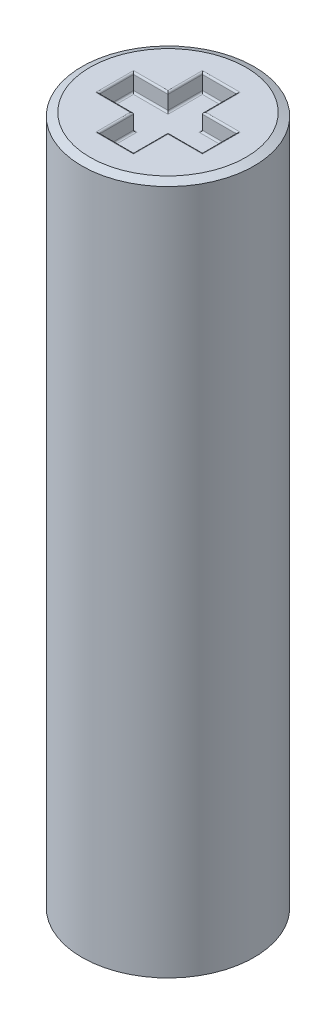
ISO-10303-21;
HEADER;
FILE_DESCRIPTION(('STEP AP214'),'2;1');
FILE_NAME('part.step','',(''),(''),'','','');
FILE_SCHEMA(('AUTOMOTIVE_DESIGN { 1 0 10303 214 1 1 1 1 }'));
ENDSEC;
DATA;
#1=APPLICATION_CONTEXT('core data for automotive mechanical design processes');
#2=APPLICATION_PROTOCOL_DEFINITION('international standard','automotive_design',2000,#1);
#3=PRODUCT_CONTEXT('',#1,'mechanical');
#4=PRODUCT('Part','Part','',(#3));
#5=PRODUCT_RELATED_PRODUCT_CATEGORY('part','',(#4));
#6=PRODUCT_DEFINITION_FORMATION('','',#4);
#7=PRODUCT_DEFINITION_CONTEXT('part definition',#1,'design');
#8=PRODUCT_DEFINITION('design','',#6,#7);
#9=PRODUCT_DEFINITION_SHAPE('','',#8);
#10=(LENGTH_UNIT() NAMED_UNIT(*) SI_UNIT(.MILLI.,.METRE.));
#11=(NAMED_UNIT(*) PLANE_ANGLE_UNIT() SI_UNIT($,.RADIAN.));
#12=(NAMED_UNIT(*) SI_UNIT($,.STERADIAN.) SOLID_ANGLE_UNIT());
#13=UNCERTAINTY_MEASURE_WITH_UNIT(LENGTH_MEASURE(1.E-05),#10,'distance_accuracy_value','');
#14=(GEOMETRIC_REPRESENTATION_CONTEXT(3) GLOBAL_UNCERTAINTY_ASSIGNED_CONTEXT((#13)) GLOBAL_UNIT_ASSIGNED_CONTEXT((#10,
#11,#12)) REPRESENTATION_CONTEXT('',''));
#15=CARTESIAN_POINT('',(0.,0.,0.));
#16=DIRECTION('',(0.,0.,1.));
#17=DIRECTION('',(1.,0.,0.));
#18=AXIS2_PLACEMENT_3D('',#15,#16,#17);
#19=CARTESIAN_POINT('',(0.,20.,0.));
#20=DIRECTION('',(0.,-1.,0.));
#21=DIRECTION('',(0.,0.,-1.));
#22=AXIS2_PLACEMENT_3D('',#19,#20,#21);
#23=CYLINDRICAL_SURFACE('',#22,2.5);
#24=CARTESIAN_POINT('',(0.,19.9,0.));
#25=DIRECTION('',(0.,1.,0.));
#26=DIRECTION('',(0.,0.,1.));
#27=AXIS2_PLACEMENT_3D('',#24,#25,#26);
#28=CIRCLE('',#27,2.5);
#29=CARTESIAN_POINT('',(0.,19.9,2.5));
#30=VERTEX_POINT('',#29);
#31=EDGE_CURVE('E236',#30,#30,#28,.F.);
#32=ORIENTED_EDGE('',*,*,#31,.T.);
#33=EDGE_LOOP('',(#32));
#34=FACE_BOUND('',#33,.T.);
#35=CARTESIAN_POINT('',(0.,0.,0.));
#36=DIRECTION('',(0.,1.,0.));
#37=DIRECTION('',(0.,0.,1.));
#38=AXIS2_PLACEMENT_3D('',#35,#36,#37);
#39=CIRCLE('',#38,2.5);
#40=CARTESIAN_POINT('',(0.,0.,2.5));
#41=VERTEX_POINT('',#40);
#42=EDGE_CURVE('E421',#41,#41,#39,.T.);
#43=ORIENTED_EDGE('',*,*,#42,.T.);
#44=EDGE_LOOP('',(#43));
#45=FACE_BOUND('',#44,.T.);
#46=ADVANCED_FACE('F40',(#34,#45),#23,.T.);
#47=CARTESIAN_POINT('',(0.,20.,0.));
#48=DIRECTION('',(0.,1.,0.));
#49=DIRECTION('',(0.,0.,1.));
#50=AXIS2_PLACEMENT_3D('',#47,#48,#49);
#51=PLANE('',#50);
#52=DIRECTION('',(0.,0.,1.));
#53=VECTOR('',#52,1.);
#54=CARTESIAN_POINT('',(-1.55,20.,-0.499999999999999));
#55=LINE('',#54,#53);
#56=CARTESIAN_POINT('',(-1.55,20.,0.550000000000001));
#57=VERTEX_POINT('',#56);
#58=CARTESIAN_POINT('',(-1.55,20.,-0.549999999999999));
#59=VERTEX_POINT('',#58);
#60=EDGE_CURVE('E266',#57,#59,#55,.F.);
#61=ORIENTED_EDGE('',*,*,#60,.T.);
#62=DIRECTION('',(-1.,0.,0.));
#63=VECTOR('',#62,1.);
#64=CARTESIAN_POINT('',(-0.5,20.,-0.549999999999999));
#65=LINE('',#64,#63);
#66=CARTESIAN_POINT('',(-0.55,20.,-0.549999999999999));
#67=VERTEX_POINT('',#66);
#68=EDGE_CURVE('E209',#59,#67,#65,.F.);
#69=ORIENTED_EDGE('',*,*,#68,.T.);
#70=DIRECTION('',(0.,0.,1.));
#71=VECTOR('',#70,1.);
#72=CARTESIAN_POINT('',(-0.55,20.,-1.5));
#73=LINE('',#72,#71);
#74=CARTESIAN_POINT('',(-0.55,20.,-1.55));
#75=VERTEX_POINT('',#74);
#76=EDGE_CURVE('E238',#67,#75,#73,.F.);
#77=ORIENTED_EDGE('',*,*,#76,.T.);
#78=DIRECTION('',(-1.,0.,0.));
#79=VECTOR('',#78,1.);
#80=CARTESIAN_POINT('',(0.5,20.,-1.55));
#81=LINE('',#80,#79);
#82=CARTESIAN_POINT('',(0.55,20.,-1.55));
#83=VERTEX_POINT('',#82);
#84=EDGE_CURVE('E247',#75,#83,#81,.F.);
#85=ORIENTED_EDGE('',*,*,#84,.T.);
#86=DIRECTION('',(0.,0.,-1.));
#87=VECTOR('',#86,1.);
#88=CARTESIAN_POINT('',(0.55,20.,-0.499999999999999));
#89=LINE('',#88,#87);
#90=CARTESIAN_POINT('',(0.55,20.,-0.549999999999999));
#91=VERTEX_POINT('',#90);
#92=EDGE_CURVE('E246',#83,#91,#89,.F.);
#93=ORIENTED_EDGE('',*,*,#92,.T.);
#94=DIRECTION('',(-1.,0.,0.));
#95=VECTOR('',#94,1.);
#96=CARTESIAN_POINT('',(1.5,20.,-0.549999999999999));
#97=LINE('',#96,#95);
#98=CARTESIAN_POINT('',(1.55,20.,-0.549999999999999));
#99=VERTEX_POINT('',#98);
#100=EDGE_CURVE('E252',#91,#99,#97,.F.);
#101=ORIENTED_EDGE('',*,*,#100,.T.);
#102=DIRECTION('',(0.,0.,-1.));
#103=VECTOR('',#102,1.);
#104=CARTESIAN_POINT('',(1.55,20.,0.500000000000001));
#105=LINE('',#104,#103);
#106=CARTESIAN_POINT('',(1.55,20.,0.550000000000001));
#107=VERTEX_POINT('',#106);
#108=EDGE_CURVE('E255',#99,#107,#105,.F.);
#109=ORIENTED_EDGE('',*,*,#108,.T.);
#110=DIRECTION('',(1.,0.,0.));
#111=VECTOR('',#110,1.);
#112=CARTESIAN_POINT('',(0.5,20.,0.550000000000001));
#113=LINE('',#112,#111);
#114=CARTESIAN_POINT('',(0.55,20.,0.550000000000001));
#115=VERTEX_POINT('',#114);
#116=EDGE_CURVE('E258',#107,#115,#113,.F.);
#117=ORIENTED_EDGE('',*,*,#116,.T.);
#118=DIRECTION('',(0.,0.,-1.));
#119=VECTOR('',#118,1.);
#120=CARTESIAN_POINT('',(0.55,20.,1.5));
#121=LINE('',#120,#119);
#122=CARTESIAN_POINT('',(0.55,20.,1.55));
#123=VERTEX_POINT('',#122);
#124=EDGE_CURVE('E256',#115,#123,#121,.F.);
#125=ORIENTED_EDGE('',*,*,#124,.T.);
#126=DIRECTION('',(1.,0.,0.));
#127=VECTOR('',#126,1.);
#128=CARTESIAN_POINT('',(-0.5,20.,1.55));
#129=LINE('',#128,#127);
#130=CARTESIAN_POINT('',(-0.55,20.,1.55));
#131=VERTEX_POINT('',#130);
#132=EDGE_CURVE('E257',#123,#131,#129,.F.);
#133=ORIENTED_EDGE('',*,*,#132,.T.);
#134=DIRECTION('',(0.,0.,1.));
#135=VECTOR('',#134,1.);
#136=CARTESIAN_POINT('',(-0.55,20.,0.500000000000001));
#137=LINE('',#136,#135);
#138=CARTESIAN_POINT('',(-0.55,20.,0.550000000000001));
#139=VERTEX_POINT('',#138);
#140=EDGE_CURVE('E265',#131,#139,#137,.F.);
#141=ORIENTED_EDGE('',*,*,#140,.T.);
#142=DIRECTION('',(1.,0.,0.));
#143=VECTOR('',#142,1.);
#144=CARTESIAN_POINT('',(-1.5,20.,0.550000000000001));
#145=LINE('',#144,#143);
#146=EDGE_CURVE('E262',#139,#57,#145,.F.);
#147=ORIENTED_EDGE('',*,*,#146,.T.);
#148=EDGE_LOOP('',(#61,#69,#77,#85,#93,#101,#109,#117,#125,#133,#141,#147));
#149=FACE_BOUND('',#148,.T.);
#150=CARTESIAN_POINT('',(0.,20.,0.));
#151=DIRECTION('',(0.,1.,0.));
#152=DIRECTION('',(0.,0.,1.));
#153=AXIS2_PLACEMENT_3D('',#150,#151,#152);
#154=CIRCLE('',#153,2.26441476341762);
#155=CARTESIAN_POINT('',(0.,20.,2.26441476341762));
#156=VERTEX_POINT('',#155);
#157=EDGE_CURVE('E242',#156,#156,#154,.T.);
#158=ORIENTED_EDGE('',*,*,#157,.T.);
#159=EDGE_LOOP('',(#158));
#160=FACE_BOUND('',#159,.T.);
#161=ADVANCED_FACE('F427',(#149,#160),#51,.T.);
#162=CARTESIAN_POINT('',(0.,0.,0.));
#163=DIRECTION('',(0.,1.,0.));
#164=DIRECTION('',(0.,0.,1.));
#165=AXIS2_PLACEMENT_3D('',#162,#163,#164);
#166=PLANE('',#165);
#167=ORIENTED_EDGE('',*,*,#42,.F.);
#168=EDGE_LOOP('',(#167));
#169=FACE_BOUND('',#168,.T.);
#170=ADVANCED_FACE('F432',(#169),#166,.F.);
#171=CARTESIAN_POINT('',(0.,20.,0.));
#172=DIRECTION('',(0.,-1.,0.));
#173=DIRECTION('',(0.,0.,-1.));
#174=AXIS2_PLACEMENT_3D('',#171,#172,#173);
#175=CONICAL_SURFACE('',#174,2.26441476341762,1.16937059883622);
#176=ORIENTED_EDGE('',*,*,#31,.F.);
#177=EDGE_LOOP('',(#176));
#178=FACE_BOUND('',#177,.T.);
#179=ORIENTED_EDGE('',*,*,#157,.F.);
#180=EDGE_LOOP('',(#179));
#181=FACE_BOUND('',#180,.T.);
#182=ADVANCED_FACE('F431',(#178,#181),#175,.T.);
#183=CARTESIAN_POINT('',(-0.5,19.5,-0.499999999999999));
#184=DIRECTION('',(-1.,0.,0.));
#185=DIRECTION('',(0.,0.,1.));
#186=AXIS2_PLACEMENT_3D('',#183,#184,#185);
#187=PLANE('',#186);
#188=DIRECTION('',(0.,1.,0.));
#189=VECTOR('',#188,1.);
#190=CARTESIAN_POINT('',(-0.5,19.5,-1.5));
#191=LINE('',#190,#189);
#192=CARTESIAN_POINT('',(-0.5,19.55,-1.5));
#193=VERTEX_POINT('',#192);
#194=CARTESIAN_POINT('',(-0.5,19.95,-1.5));
#195=VERTEX_POINT('',#194);
#196=EDGE_CURVE('E422',#193,#195,#191,.T.);
#197=ORIENTED_EDGE('',*,*,#196,.T.);
#198=DIRECTION('',(0.,0.,1.));
#199=VECTOR('',#198,1.);
#200=CARTESIAN_POINT('',(-0.5,19.95,-0.499999999999999));
#201=LINE('',#200,#199);
#202=CARTESIAN_POINT('',(-0.5,19.95,-0.499999999999999));
#203=VERTEX_POINT('',#202);
#204=EDGE_CURVE('E309',#195,#203,#201,.T.);
#205=ORIENTED_EDGE('',*,*,#204,.T.);
#206=DIRECTION('',(0.,1.,0.));
#207=VECTOR('',#206,1.);
#208=CARTESIAN_POINT('',(-0.5,19.5,-0.499999999999999));
#209=LINE('',#208,#207);
#210=CARTESIAN_POINT('',(-0.5,19.55,-0.499999999999999));
#211=VERTEX_POINT('',#210);
#212=EDGE_CURVE('E222',#211,#203,#209,.T.);
#213=ORIENTED_EDGE('',*,*,#212,.F.);
#214=DIRECTION('',(0.,0.,1.));
#215=VECTOR('',#214,1.);
#216=CARTESIAN_POINT('',(-0.5,19.55,-0.499999999999999));
#217=LINE('',#216,#215);
#218=EDGE_CURVE('E306',#211,#193,#217,.F.);
#219=ORIENTED_EDGE('',*,*,#218,.T.);
#220=EDGE_LOOP('',(#197,#205,#213,#219));
#221=FACE_BOUND('',#220,.T.);
#222=ADVANCED_FACE('F433',(#221),#187,.F.);
#223=CARTESIAN_POINT('',(0.5,19.5,-1.5));
#224=DIRECTION('',(0.,0.,-1.));
#225=DIRECTION('',(-1.,0.,0.));
#226=AXIS2_PLACEMENT_3D('',#223,#224,#225);
#227=PLANE('',#226);
#228=DIRECTION('',(0.,1.,0.));
#229=VECTOR('',#228,1.);
#230=CARTESIAN_POINT('',(0.5,19.5,-1.5));
#231=LINE('',#230,#229);
#232=CARTESIAN_POINT('',(0.5,19.55,-1.5));
#233=VERTEX_POINT('',#232);
#234=CARTESIAN_POINT('',(0.5,19.95,-1.5));
#235=VERTEX_POINT('',#234);
#236=EDGE_CURVE('E611',#233,#235,#231,.T.);
#237=ORIENTED_EDGE('',*,*,#236,.T.);
#238=DIRECTION('',(-1.,0.,0.));
#239=VECTOR('',#238,1.);
#240=CARTESIAN_POINT('',(-0.5,19.95,-1.5));
#241=LINE('',#240,#239);
#242=EDGE_CURVE('E308',#235,#195,#241,.T.);
#243=ORIENTED_EDGE('',*,*,#242,.T.);
#244=ORIENTED_EDGE('',*,*,#196,.F.);
#245=DIRECTION('',(-1.,0.,0.));
#246=VECTOR('',#245,1.);
#247=CARTESIAN_POINT('',(0.5,19.55,-1.5));
#248=LINE('',#247,#246);
#249=EDGE_CURVE('E302',#193,#233,#248,.F.);
#250=ORIENTED_EDGE('',*,*,#249,.T.);
#251=EDGE_LOOP('',(#237,#243,#244,#250));
#252=FACE_BOUND('',#251,.T.);
#253=ADVANCED_FACE('F445',(#252),#227,.F.);
#254=CARTESIAN_POINT('',(0.5,19.5,-0.499999999999999));
#255=DIRECTION('',(1.,0.,0.));
#256=DIRECTION('',(0.,0.,-1.));
#257=AXIS2_PLACEMENT_3D('',#254,#255,#256);
#258=PLANE('',#257);
#259=DIRECTION('',(0.,1.,0.));
#260=VECTOR('',#259,1.);
#261=CARTESIAN_POINT('',(0.5,19.5,-0.499999999999999));
#262=LINE('',#261,#260);
#263=CARTESIAN_POINT('',(0.5,19.55,-0.499999999999999));
#264=VERTEX_POINT('',#263);
#265=CARTESIAN_POINT('',(0.5,19.95,-0.499999999999999));
#266=VERTEX_POINT('',#265);
#267=EDGE_CURVE('E608',#264,#266,#262,.T.);
#268=ORIENTED_EDGE('',*,*,#267,.T.);
#269=DIRECTION('',(0.,0.,-1.));
#270=VECTOR('',#269,1.);
#271=CARTESIAN_POINT('',(0.5,19.95,-1.5));
#272=LINE('',#271,#270);
#273=EDGE_CURVE('E303',#266,#235,#272,.T.);
#274=ORIENTED_EDGE('',*,*,#273,.T.);
#275=ORIENTED_EDGE('',*,*,#236,.F.);
#276=DIRECTION('',(0.,0.,-1.));
#277=VECTOR('',#276,1.);
#278=CARTESIAN_POINT('',(0.5,19.55,-0.499999999999999));
#279=LINE('',#278,#277);
#280=EDGE_CURVE('E300',#233,#264,#279,.F.);
#281=ORIENTED_EDGE('',*,*,#280,.T.);
#282=EDGE_LOOP('',(#268,#274,#275,#281));
#283=FACE_BOUND('',#282,.T.);
#284=ADVANCED_FACE('F486',(#283),#258,.F.);
#285=CARTESIAN_POINT('',(0.5,19.5,-0.499999999999999));
#286=DIRECTION('',(0.,0.,-1.));
#287=DIRECTION('',(-1.,0.,0.));
#288=AXIS2_PLACEMENT_3D('',#285,#286,#287);
#289=PLANE('',#288);
#290=DIRECTION('',(0.,1.,0.));
#291=VECTOR('',#290,1.);
#292=CARTESIAN_POINT('',(1.5,19.5,-0.499999999999999));
#293=LINE('',#292,#291);
#294=CARTESIAN_POINT('',(1.5,19.55,-0.499999999999999));
#295=VERTEX_POINT('',#294);
#296=CARTESIAN_POINT('',(1.5,19.95,-0.499999999999999));
#297=VERTEX_POINT('',#296);
#298=EDGE_CURVE('E609',#295,#297,#293,.T.);
#299=ORIENTED_EDGE('',*,*,#298,.T.);
#300=DIRECTION('',(-1.,0.,0.));
#301=VECTOR('',#300,1.);
#302=CARTESIAN_POINT('',(0.5,19.95,-0.499999999999999));
#303=LINE('',#302,#301);
#304=EDGE_CURVE('E299',#297,#266,#303,.T.);
#305=ORIENTED_EDGE('',*,*,#304,.T.);
#306=ORIENTED_EDGE('',*,*,#267,.F.);
#307=DIRECTION('',(-1.,0.,0.));
#308=VECTOR('',#307,1.);
#309=CARTESIAN_POINT('',(0.5,19.55,-0.499999999999999));
#310=LINE('',#309,#308);
#311=EDGE_CURVE('E293',#264,#295,#310,.F.);
#312=ORIENTED_EDGE('',*,*,#311,.T.);
#313=EDGE_LOOP('',(#299,#305,#306,#312));
#314=FACE_BOUND('',#313,.T.);
#315=ADVANCED_FACE('F485',(#314),#289,.F.);
#316=CARTESIAN_POINT('',(1.5,19.5,0.500000000000001));
#317=DIRECTION('',(1.,0.,0.));
#318=DIRECTION('',(0.,0.,-1.));
#319=AXIS2_PLACEMENT_3D('',#316,#317,#318);
#320=PLANE('',#319);
#321=DIRECTION('',(0.,1.,0.));
#322=VECTOR('',#321,1.);
#323=CARTESIAN_POINT('',(1.5,19.5,0.500000000000001));
#324=LINE('',#323,#322);
#325=CARTESIAN_POINT('',(1.5,19.55,0.500000000000001));
#326=VERTEX_POINT('',#325);
#327=CARTESIAN_POINT('',(1.5,19.95,0.500000000000001));
#328=VERTEX_POINT('',#327);
#329=EDGE_CURVE('E605',#326,#328,#324,.T.);
#330=ORIENTED_EDGE('',*,*,#329,.T.);
#331=DIRECTION('',(0.,0.,-1.));
#332=VECTOR('',#331,1.);
#333=CARTESIAN_POINT('',(1.5,19.95,-0.499999999999999));
#334=LINE('',#333,#332);
#335=EDGE_CURVE('E291',#328,#297,#334,.T.);
#336=ORIENTED_EDGE('',*,*,#335,.T.);
#337=ORIENTED_EDGE('',*,*,#298,.F.);
#338=DIRECTION('',(0.,0.,-1.));
#339=VECTOR('',#338,1.);
#340=CARTESIAN_POINT('',(1.5,19.55,0.500000000000001));
#341=LINE('',#340,#339);
#342=EDGE_CURVE('E292',#295,#326,#341,.F.);
#343=ORIENTED_EDGE('',*,*,#342,.T.);
#344=EDGE_LOOP('',(#330,#336,#337,#343));
#345=FACE_BOUND('',#344,.T.);
#346=ADVANCED_FACE('F476',(#345),#320,.F.);
#347=CARTESIAN_POINT('',(0.5,19.5,0.500000000000001));
#348=DIRECTION('',(0.,0.,1.));
#349=DIRECTION('',(1.,0.,0.));
#350=AXIS2_PLACEMENT_3D('',#347,#348,#349);
#351=PLANE('',#350);
#352=DIRECTION('',(0.,1.,0.));
#353=VECTOR('',#352,1.);
#354=CARTESIAN_POINT('',(0.5,19.5,0.500000000000001));
#355=LINE('',#354,#353);
#356=CARTESIAN_POINT('',(0.5,19.55,0.500000000000001));
#357=VERTEX_POINT('',#356);
#358=CARTESIAN_POINT('',(0.5,19.95,0.500000000000001));
#359=VERTEX_POINT('',#358);
#360=EDGE_CURVE('E418',#357,#359,#355,.T.);
#361=ORIENTED_EDGE('',*,*,#360,.T.);
#362=DIRECTION('',(1.,0.,0.));
#363=VECTOR('',#362,1.);
#364=CARTESIAN_POINT('',(1.5,19.95,0.500000000000001));
#365=LINE('',#364,#363);
#366=EDGE_CURVE('E290',#359,#328,#365,.T.);
#367=ORIENTED_EDGE('',*,*,#366,.T.);
#368=ORIENTED_EDGE('',*,*,#329,.F.);
#369=DIRECTION('',(1.,0.,0.));
#370=VECTOR('',#369,1.);
#371=CARTESIAN_POINT('',(0.5,19.55,0.500000000000001));
#372=LINE('',#371,#370);
#373=EDGE_CURVE('E289',#326,#357,#372,.F.);
#374=ORIENTED_EDGE('',*,*,#373,.T.);
#375=EDGE_LOOP('',(#361,#367,#368,#374));
#376=FACE_BOUND('',#375,.T.);
#377=ADVANCED_FACE('F475',(#376),#351,.F.);
#378=CARTESIAN_POINT('',(0.5,19.5,1.5));
#379=DIRECTION('',(1.,0.,0.));
#380=DIRECTION('',(0.,0.,-1.));
#381=AXIS2_PLACEMENT_3D('',#378,#379,#380);
#382=PLANE('',#381);
#383=DIRECTION('',(0.,1.,0.));
#384=VECTOR('',#383,1.);
#385=CARTESIAN_POINT('',(0.5,19.5,1.5));
#386=LINE('',#385,#384);
#387=CARTESIAN_POINT('',(0.5,19.55,1.5));
#388=VERTEX_POINT('',#387);
#389=CARTESIAN_POINT('',(0.5,19.95,1.5));
#390=VERTEX_POINT('',#389);
#391=EDGE_CURVE('E407',#388,#390,#386,.T.);
#392=ORIENTED_EDGE('',*,*,#391,.T.);
#393=DIRECTION('',(0.,0.,-1.));
#394=VECTOR('',#393,1.);
#395=CARTESIAN_POINT('',(0.5,19.95,0.500000000000001));
#396=LINE('',#395,#394);
#397=EDGE_CURVE('E281',#390,#359,#396,.T.);
#398=ORIENTED_EDGE('',*,*,#397,.T.);
#399=ORIENTED_EDGE('',*,*,#360,.F.);
#400=DIRECTION('',(0.,0.,-1.));
#401=VECTOR('',#400,1.);
#402=CARTESIAN_POINT('',(0.5,19.55,1.5));
#403=LINE('',#402,#401);
#404=EDGE_CURVE('E282',#357,#388,#403,.F.);
#405=ORIENTED_EDGE('',*,*,#404,.T.);
#406=EDGE_LOOP('',(#392,#398,#399,#405));
#407=FACE_BOUND('',#406,.T.);
#408=ADVANCED_FACE('F473',(#407),#382,.F.);
#409=CARTESIAN_POINT('',(0.5,19.5,1.5));
#410=DIRECTION('',(0.,0.,1.));
#411=DIRECTION('',(1.,0.,0.));
#412=AXIS2_PLACEMENT_3D('',#409,#410,#411);
#413=PLANE('',#412);
#414=DIRECTION('',(0.,1.,0.));
#415=VECTOR('',#414,1.);
#416=CARTESIAN_POINT('',(-0.5,19.5,1.5));
#417=LINE('',#416,#415);
#418=CARTESIAN_POINT('',(-0.5,19.55,1.5));
#419=VERTEX_POINT('',#418);
#420=CARTESIAN_POINT('',(-0.5,19.95,1.5));
#421=VERTEX_POINT('',#420);
#422=EDGE_CURVE('E403',#419,#421,#417,.T.);
#423=ORIENTED_EDGE('',*,*,#422,.T.);
#424=DIRECTION('',(1.,0.,0.));
#425=VECTOR('',#424,1.);
#426=CARTESIAN_POINT('',(0.5,19.95,1.5));
#427=LINE('',#426,#425);
#428=EDGE_CURVE('E283',#421,#390,#427,.T.);
#429=ORIENTED_EDGE('',*,*,#428,.T.);
#430=ORIENTED_EDGE('',*,*,#391,.F.);
#431=DIRECTION('',(1.,0.,0.));
#432=VECTOR('',#431,1.);
#433=CARTESIAN_POINT('',(0.5,19.55,1.5));
#434=LINE('',#433,#432);
#435=EDGE_CURVE('E276',#388,#419,#434,.F.);
#436=ORIENTED_EDGE('',*,*,#435,.T.);
#437=EDGE_LOOP('',(#423,#429,#430,#436));
#438=FACE_BOUND('',#437,.T.);
#439=ADVANCED_FACE('F404',(#438),#413,.F.);
#440=CARTESIAN_POINT('',(-0.5,19.5,1.5));
#441=DIRECTION('',(-1.,0.,0.));
#442=DIRECTION('',(0.,0.,1.));
#443=AXIS2_PLACEMENT_3D('',#440,#441,#442);
#444=PLANE('',#443);
#445=DIRECTION('',(0.,1.,0.));
#446=VECTOR('',#445,1.);
#447=CARTESIAN_POINT('',(-0.5,19.5,0.500000000000001));
#448=LINE('',#447,#446);
#449=CARTESIAN_POINT('',(-0.5,19.55,0.500000000000001));
#450=VERTEX_POINT('',#449);
#451=CARTESIAN_POINT('',(-0.5,19.95,0.500000000000001));
#452=VERTEX_POINT('',#451);
#453=EDGE_CURVE('E415',#450,#452,#448,.T.);
#454=ORIENTED_EDGE('',*,*,#453,.T.);
#455=DIRECTION('',(0.,0.,1.));
#456=VECTOR('',#455,1.);
#457=CARTESIAN_POINT('',(-0.5,19.95,1.5));
#458=LINE('',#457,#456);
#459=EDGE_CURVE('E280',#452,#421,#458,.T.);
#460=ORIENTED_EDGE('',*,*,#459,.T.);
#461=ORIENTED_EDGE('',*,*,#422,.F.);
#462=DIRECTION('',(0.,0.,1.));
#463=VECTOR('',#462,1.);
#464=CARTESIAN_POINT('',(-0.5,19.55,1.5));
#465=LINE('',#464,#463);
#466=EDGE_CURVE('E274',#419,#450,#465,.F.);
#467=ORIENTED_EDGE('',*,*,#466,.T.);
#468=EDGE_LOOP('',(#454,#460,#461,#467));
#469=FACE_BOUND('',#468,.T.);
#470=ADVANCED_FACE('F413',(#469),#444,.F.);
#471=CARTESIAN_POINT('',(-1.5,19.5,0.500000000000001));
#472=DIRECTION('',(0.,0.,1.));
#473=DIRECTION('',(1.,0.,0.));
#474=AXIS2_PLACEMENT_3D('',#471,#472,#473);
#475=PLANE('',#474);
#476=DIRECTION('',(0.,1.,0.));
#477=VECTOR('',#476,1.);
#478=CARTESIAN_POINT('',(-1.5,19.5,0.500000000000001));
#479=LINE('',#478,#477);
#480=CARTESIAN_POINT('',(-1.5,19.55,0.500000000000001));
#481=VERTEX_POINT('',#480);
#482=CARTESIAN_POINT('',(-1.5,19.95,0.500000000000001));
#483=VERTEX_POINT('',#482);
#484=EDGE_CURVE('E204',#481,#483,#479,.T.);
#485=ORIENTED_EDGE('',*,*,#484,.T.);
#486=DIRECTION('',(1.,0.,0.));
#487=VECTOR('',#486,1.);
#488=CARTESIAN_POINT('',(-0.5,19.95,0.500000000000001));
#489=LINE('',#488,#487);
#490=EDGE_CURVE('E272',#483,#452,#489,.T.);
#491=ORIENTED_EDGE('',*,*,#490,.T.);
#492=ORIENTED_EDGE('',*,*,#453,.F.);
#493=DIRECTION('',(1.,0.,0.));
#494=VECTOR('',#493,1.);
#495=CARTESIAN_POINT('',(-1.5,19.55,0.500000000000001));
#496=LINE('',#495,#494);
#497=EDGE_CURVE('E271',#450,#481,#496,.F.);
#498=ORIENTED_EDGE('',*,*,#497,.T.);
#499=EDGE_LOOP('',(#485,#491,#492,#498));
#500=FACE_BOUND('',#499,.T.);
#501=ADVANCED_FACE('F462',(#500),#475,.F.);
#502=CARTESIAN_POINT('',(-1.5,19.5,0.500000000000001));
#503=DIRECTION('',(-1.,0.,0.));
#504=DIRECTION('',(0.,0.,1.));
#505=AXIS2_PLACEMENT_3D('',#502,#503,#504);
#506=PLANE('',#505);
#507=DIRECTION('',(0.,1.,0.));
#508=VECTOR('',#507,1.);
#509=CARTESIAN_POINT('',(-1.5,19.5,-0.499999999999999));
#510=LINE('',#509,#508);
#511=CARTESIAN_POINT('',(-1.5,19.55,-0.499999999999999));
#512=VERTEX_POINT('',#511);
#513=CARTESIAN_POINT('',(-1.5,19.95,-0.499999999999999));
#514=VERTEX_POINT('',#513);
#515=EDGE_CURVE('E205',#512,#514,#510,.T.);
#516=ORIENTED_EDGE('',*,*,#515,.T.);
#517=DIRECTION('',(0.,0.,1.));
#518=VECTOR('',#517,1.);
#519=CARTESIAN_POINT('',(-1.5,19.95,0.500000000000001));
#520=LINE('',#519,#518);
#521=EDGE_CURVE('E207',#514,#483,#520,.T.);
#522=ORIENTED_EDGE('',*,*,#521,.T.);
#523=ORIENTED_EDGE('',*,*,#484,.F.);
#524=DIRECTION('',(0.,0.,1.));
#525=VECTOR('',#524,1.);
#526=CARTESIAN_POINT('',(-1.5,19.55,0.500000000000001));
#527=LINE('',#526,#525);
#528=EDGE_CURVE('E200',#481,#512,#527,.F.);
#529=ORIENTED_EDGE('',*,*,#528,.T.);
#530=EDGE_LOOP('',(#516,#522,#523,#529));
#531=FACE_BOUND('',#530,.T.);
#532=ADVANCED_FACE('F203',(#531),#506,.F.);
#533=CARTESIAN_POINT('',(-1.5,19.5,-0.499999999999999));
#534=DIRECTION('',(0.,0.,-1.));
#535=DIRECTION('',(-1.,0.,0.));
#536=AXIS2_PLACEMENT_3D('',#533,#534,#535);
#537=PLANE('',#536);
#538=ORIENTED_EDGE('',*,*,#212,.T.);
#539=DIRECTION('',(-1.,0.,0.));
#540=VECTOR('',#539,1.);
#541=CARTESIAN_POINT('',(-1.5,19.95,-0.499999999999999));
#542=LINE('',#541,#540);
#543=EDGE_CURVE('E219',#203,#514,#542,.T.);
#544=ORIENTED_EDGE('',*,*,#543,.T.);
#545=ORIENTED_EDGE('',*,*,#515,.F.);
#546=DIRECTION('',(-1.,0.,0.));
#547=VECTOR('',#546,1.);
#548=CARTESIAN_POINT('',(-1.5,19.55,-0.499999999999999));
#549=LINE('',#548,#547);
#550=EDGE_CURVE('E220',#512,#211,#549,.F.);
#551=ORIENTED_EDGE('',*,*,#550,.T.);
#552=EDGE_LOOP('',(#538,#544,#545,#551));
#553=FACE_BOUND('',#552,.T.);
#554=ADVANCED_FACE('F214',(#553),#537,.F.);
#555=CARTESIAN_POINT('',(0.,19.5,0.));
#556=DIRECTION('',(0.,1.,0.));
#557=DIRECTION('',(0.,0.,1.));
#558=AXIS2_PLACEMENT_3D('',#555,#556,#557);
#559=PLANE('',#558);
#560=DIRECTION('',(0.,0.,-1.));
#561=VECTOR('',#560,1.);
#562=CARTESIAN_POINT('',(0.45,19.5,0.));
#563=LINE('',#562,#561);
#564=CARTESIAN_POINT('',(0.45,19.5,-0.449999999999999));
#565=VERTEX_POINT('',#564);
#566=CARTESIAN_POINT('',(0.45,19.5,-1.45));
#567=VERTEX_POINT('',#566);
#568=EDGE_CURVE('E46',#565,#567,#563,.T.);
#569=ORIENTED_EDGE('',*,*,#568,.T.);
#570=DIRECTION('',(-1.,0.,0.));
#571=VECTOR('',#570,1.);
#572=CARTESIAN_POINT('',(0.,19.5,-1.45));
#573=LINE('',#572,#571);
#574=CARTESIAN_POINT('',(-0.45,19.5,-1.45));
#575=VERTEX_POINT('',#574);
#576=EDGE_CURVE('E11',#567,#575,#573,.T.);
#577=ORIENTED_EDGE('',*,*,#576,.T.);
#578=DIRECTION('',(0.,0.,1.));
#579=VECTOR('',#578,1.);
#580=CARTESIAN_POINT('',(-0.45,19.5,0.));
#581=LINE('',#580,#579);
#582=CARTESIAN_POINT('',(-0.45,19.5,-0.449999999999999));
#583=VERTEX_POINT('',#582);
#584=EDGE_CURVE('E315',#575,#583,#581,.T.);
#585=ORIENTED_EDGE('',*,*,#584,.T.);
#586=DIRECTION('',(-1.,0.,0.));
#587=VECTOR('',#586,1.);
#588=CARTESIAN_POINT('',(0.,19.5,-0.449999999999999));
#589=LINE('',#588,#587);
#590=CARTESIAN_POINT('',(-1.45,19.5,-0.449999999999999));
#591=VERTEX_POINT('',#590);
#592=EDGE_CURVE('E314',#583,#591,#589,.T.);
#593=ORIENTED_EDGE('',*,*,#592,.T.);
#594=DIRECTION('',(0.,0.,1.));
#595=VECTOR('',#594,1.);
#596=CARTESIAN_POINT('',(-1.45,19.5,0.));
#597=LINE('',#596,#595);
#598=CARTESIAN_POINT('',(-1.45,19.5,0.450000000000001));
#599=VERTEX_POINT('',#598);
#600=EDGE_CURVE('E229',#591,#599,#597,.T.);
#601=ORIENTED_EDGE('',*,*,#600,.T.);
#602=DIRECTION('',(1.,0.,0.));
#603=VECTOR('',#602,1.);
#604=CARTESIAN_POINT('',(0.,19.5,0.450000000000001));
#605=LINE('',#604,#603);
#606=CARTESIAN_POINT('',(-0.45,19.5,0.450000000000001));
#607=VERTEX_POINT('',#606);
#608=EDGE_CURVE('E320',#599,#607,#605,.T.);
#609=ORIENTED_EDGE('',*,*,#608,.T.);
#610=DIRECTION('',(0.,0.,1.));
#611=VECTOR('',#610,1.);
#612=CARTESIAN_POINT('',(-0.45,19.5,0.));
#613=LINE('',#612,#611);
#614=CARTESIAN_POINT('',(-0.45,19.5,1.45));
#615=VERTEX_POINT('',#614);
#616=EDGE_CURVE('E317',#607,#615,#613,.T.);
#617=ORIENTED_EDGE('',*,*,#616,.T.);
#618=DIRECTION('',(1.,0.,0.));
#619=VECTOR('',#618,1.);
#620=CARTESIAN_POINT('',(0.,19.5,1.45));
#621=LINE('',#620,#619);
#622=CARTESIAN_POINT('',(0.45,19.5,1.45));
#623=VERTEX_POINT('',#622);
#624=EDGE_CURVE('E321',#615,#623,#621,.T.);
#625=ORIENTED_EDGE('',*,*,#624,.T.);
#626=DIRECTION('',(0.,0.,-1.));
#627=VECTOR('',#626,1.);
#628=CARTESIAN_POINT('',(0.45,19.5,0.));
#629=LINE('',#628,#627);
#630=CARTESIAN_POINT('',(0.45,19.5,0.450000000000001));
#631=VERTEX_POINT('',#630);
#632=EDGE_CURVE('E323',#623,#631,#629,.T.);
#633=ORIENTED_EDGE('',*,*,#632,.T.);
#634=DIRECTION('',(1.,0.,0.));
#635=VECTOR('',#634,1.);
#636=CARTESIAN_POINT('',(0.,19.5,0.450000000000001));
#637=LINE('',#636,#635);
#638=CARTESIAN_POINT('',(1.45,19.5,0.450000000000001));
#639=VERTEX_POINT('',#638);
#640=EDGE_CURVE('E324',#631,#639,#637,.T.);
#641=ORIENTED_EDGE('',*,*,#640,.T.);
#642=DIRECTION('',(0.,0.,-1.));
#643=VECTOR('',#642,1.);
#644=CARTESIAN_POINT('',(1.45,19.5,0.));
#645=LINE('',#644,#643);
#646=CARTESIAN_POINT('',(1.45,19.5,-0.449999999999999));
#647=VERTEX_POINT('',#646);
#648=EDGE_CURVE('E330',#639,#647,#645,.T.);
#649=ORIENTED_EDGE('',*,*,#648,.T.);
#650=DIRECTION('',(-1.,0.,0.));
#651=VECTOR('',#650,1.);
#652=CARTESIAN_POINT('',(0.,19.5,-0.449999999999999));
#653=LINE('',#652,#651);
#654=EDGE_CURVE('E60',#647,#565,#653,.T.);
#655=ORIENTED_EDGE('',*,*,#654,.T.);
#656=EDGE_LOOP('',(#569,#577,#585,#593,#601,#609,#617,#625,#633,#641,#649,#655));
#657=FACE_BOUND('',#656,.T.);
#658=ADVANCED_FACE('F458',(#657),#559,.T.);
#659=CARTESIAN_POINT('',(0.5,19.95,0.550000000000001));
#660=DIRECTION('',(-1.,0.,0.));
#661=DIRECTION('',(0.,0.,1.));
#662=AXIS2_PLACEMENT_3D('',#659,#660,#661);
#663=CYLINDRICAL_SURFACE('',#662,0.05);
#664=CARTESIAN_POINT('',(0.55,19.95,0.550000000000001));
#665=DIRECTION('',(-0.707106781186547,0.,0.707106781186548));
#666=DIRECTION('',(-0.707106781186547,0.,-0.707106781186547));
#667=AXIS2_PLACEMENT_3D('',#664,#665,#666);
#668=ELLIPSE('',#667,0.0707106781186548,0.05);
#669=EDGE_CURVE('E360',#115,#359,#668,.T.);
#670=ORIENTED_EDGE('',*,*,#669,.F.);
#671=ORIENTED_EDGE('',*,*,#116,.F.);
#672=CARTESIAN_POINT('',(1.55,19.95,0.550000000000001));
#673=DIRECTION('',(-0.707106781186547,0.,0.707106781186547));
#674=DIRECTION('',(-0.707106781186547,0.,-0.707106781186547));
#675=AXIS2_PLACEMENT_3D('',#672,#673,#674);
#676=ELLIPSE('',#675,0.0707106781186548,0.05);
#677=EDGE_CURVE('E362',#328,#107,#676,.F.);
#678=ORIENTED_EDGE('',*,*,#677,.F.);
#679=ORIENTED_EDGE('',*,*,#366,.F.);
#680=EDGE_LOOP('',(#670,#671,#678,#679));
#681=FACE_BOUND('',#680,.T.);
#682=ADVANCED_FACE('F494',(#681),#663,.T.);
#683=CARTESIAN_POINT('',(1.55,19.95,0.500000000000001));
#684=DIRECTION('',(0.,0.,1.));
#685=DIRECTION('',(1.,0.,0.));
#686=AXIS2_PLACEMENT_3D('',#683,#684,#685);
#687=CYLINDRICAL_SURFACE('',#686,0.05);
#688=ORIENTED_EDGE('',*,*,#677,.T.);
#689=ORIENTED_EDGE('',*,*,#108,.F.);
#690=CARTESIAN_POINT('',(1.55,19.95,-0.549999999999999));
#691=DIRECTION('',(0.707106781186547,0.,0.707106781186547));
#692=DIRECTION('',(-0.707106781186547,0.,0.707106781186547));
#693=AXIS2_PLACEMENT_3D('',#690,#691,#692);
#694=ELLIPSE('',#693,0.0707106781186548,0.05);
#695=EDGE_CURVE('E358',#297,#99,#694,.F.);
#696=ORIENTED_EDGE('',*,*,#695,.F.);
#697=ORIENTED_EDGE('',*,*,#335,.F.);
#698=EDGE_LOOP('',(#688,#689,#696,#697));
#699=FACE_BOUND('',#698,.T.);
#700=ADVANCED_FACE('F496',(#699),#687,.T.);
#701=CARTESIAN_POINT('',(0.55,19.95,1.5));
#702=DIRECTION('',(0.,0.,1.));
#703=DIRECTION('',(1.,0.,0.));
#704=AXIS2_PLACEMENT_3D('',#701,#702,#703);
#705=CYLINDRICAL_SURFACE('',#704,0.05);
#706=ORIENTED_EDGE('',*,*,#669,.T.);
#707=ORIENTED_EDGE('',*,*,#397,.F.);
#708=CARTESIAN_POINT('',(0.55,19.95,1.55));
#709=DIRECTION('',(-0.707106781186547,0.,0.707106781186548));
#710=DIRECTION('',(-0.707106781186547,0.,-0.707106781186547));
#711=AXIS2_PLACEMENT_3D('',#708,#709,#710);
#712=ELLIPSE('',#711,0.0707106781186548,0.05);
#713=EDGE_CURVE('E352',#123,#390,#712,.T.);
#714=ORIENTED_EDGE('',*,*,#713,.F.);
#715=ORIENTED_EDGE('',*,*,#124,.F.);
#716=EDGE_LOOP('',(#706,#707,#714,#715));
#717=FACE_BOUND('',#716,.T.);
#718=ADVANCED_FACE('F501',(#717),#705,.T.);
#719=CARTESIAN_POINT('',(0.5,19.95,-0.549999999999999));
#720=DIRECTION('',(1.,0.,0.));
#721=DIRECTION('',(0.,0.,-1.));
#722=AXIS2_PLACEMENT_3D('',#719,#720,#721);
#723=CYLINDRICAL_SURFACE('',#722,0.05);
#724=ORIENTED_EDGE('',*,*,#695,.T.);
#725=ORIENTED_EDGE('',*,*,#100,.F.);
#726=CARTESIAN_POINT('',(0.55,19.95,-0.549999999999999));
#727=DIRECTION('',(0.707106781186547,0.,0.707106781186548));
#728=DIRECTION('',(-0.707106781186547,0.,0.707106781186547));
#729=AXIS2_PLACEMENT_3D('',#726,#727,#728);
#730=ELLIPSE('',#729,0.0707106781186548,0.05);
#731=EDGE_CURVE('E348',#266,#91,#730,.F.);
#732=ORIENTED_EDGE('',*,*,#731,.F.);
#733=ORIENTED_EDGE('',*,*,#304,.F.);
#734=EDGE_LOOP('',(#724,#725,#732,#733));
#735=FACE_BOUND('',#734,.T.);
#736=ADVANCED_FACE('F585',(#735),#723,.T.);
#737=CARTESIAN_POINT('',(0.5,19.95,1.55));
#738=DIRECTION('',(-1.,0.,0.));
#739=DIRECTION('',(0.,0.,1.));
#740=AXIS2_PLACEMENT_3D('',#737,#738,#739);
#741=CYLINDRICAL_SURFACE('',#740,0.05);
#742=ORIENTED_EDGE('',*,*,#713,.T.);
#743=ORIENTED_EDGE('',*,*,#428,.F.);
#744=CARTESIAN_POINT('',(-0.55,19.95,1.55));
#745=DIRECTION('',(-0.707106781186547,0.,-0.707106781186547));
#746=DIRECTION('',(0.707106781186547,0.,-0.707106781186548));
#747=AXIS2_PLACEMENT_3D('',#744,#745,#746);
#748=ELLIPSE('',#747,0.0707106781186548,0.05);
#749=EDGE_CURVE('E350',#131,#421,#748,.T.);
#750=ORIENTED_EDGE('',*,*,#749,.F.);
#751=ORIENTED_EDGE('',*,*,#132,.F.);
#752=EDGE_LOOP('',(#742,#743,#750,#751));
#753=FACE_BOUND('',#752,.T.);
#754=ADVANCED_FACE('F576',(#753),#741,.T.);
#755=CARTESIAN_POINT('',(0.55,19.95,-0.499999999999999));
#756=DIRECTION('',(0.,0.,1.));
#757=DIRECTION('',(1.,0.,0.));
#758=AXIS2_PLACEMENT_3D('',#755,#756,#757);
#759=CYLINDRICAL_SURFACE('',#758,0.05);
#760=ORIENTED_EDGE('',*,*,#731,.T.);
#761=ORIENTED_EDGE('',*,*,#92,.F.);
#762=CARTESIAN_POINT('',(0.55,19.95,-1.55));
#763=DIRECTION('',(0.707106781186547,0.,0.707106781186547));
#764=DIRECTION('',(-0.707106781186547,0.,0.707106781186548));
#765=AXIS2_PLACEMENT_3D('',#762,#763,#764);
#766=ELLIPSE('',#765,0.0707106781186548,0.05);
#767=EDGE_CURVE('E345',#235,#83,#766,.F.);
#768=ORIENTED_EDGE('',*,*,#767,.F.);
#769=ORIENTED_EDGE('',*,*,#273,.F.);
#770=EDGE_LOOP('',(#760,#761,#768,#769));
#771=FACE_BOUND('',#770,.T.);
#772=ADVANCED_FACE('F578',(#771),#759,.T.);
#773=CARTESIAN_POINT('',(-0.55,19.95,1.5));
#774=DIRECTION('',(0.,0.,-1.));
#775=DIRECTION('',(-1.,0.,0.));
#776=AXIS2_PLACEMENT_3D('',#773,#774,#775);
#777=CYLINDRICAL_SURFACE('',#776,0.05);
#778=ORIENTED_EDGE('',*,*,#749,.T.);
#779=ORIENTED_EDGE('',*,*,#459,.F.);
#780=CARTESIAN_POINT('',(-0.55,19.95,0.550000000000001));
#781=DIRECTION('',(-0.707106781186547,0.,-0.707106781186547));
#782=DIRECTION('',(0.707106781186547,0.,-0.707106781186548));
#783=AXIS2_PLACEMENT_3D('',#780,#781,#782);
#784=ELLIPSE('',#783,0.0707106781186548,0.05);
#785=EDGE_CURVE('E343',#139,#452,#784,.T.);
#786=ORIENTED_EDGE('',*,*,#785,.F.);
#787=ORIENTED_EDGE('',*,*,#140,.F.);
#788=EDGE_LOOP('',(#778,#779,#786,#787));
#789=FACE_BOUND('',#788,.T.);
#790=ADVANCED_FACE('F574',(#789),#777,.T.);
#791=CARTESIAN_POINT('',(0.5,19.95,-1.55));
#792=DIRECTION('',(1.,0.,0.));
#793=DIRECTION('',(0.,0.,-1.));
#794=AXIS2_PLACEMENT_3D('',#791,#792,#793);
#795=CYLINDRICAL_SURFACE('',#794,0.05);
#796=ORIENTED_EDGE('',*,*,#767,.T.);
#797=ORIENTED_EDGE('',*,*,#84,.F.);
#798=CARTESIAN_POINT('',(-0.55,19.95,-1.55));
#799=DIRECTION('',(0.707106781186547,0.,-0.707106781186548));
#800=DIRECTION('',(0.707106781186548,0.,0.707106781186547));
#801=AXIS2_PLACEMENT_3D('',#798,#799,#800);
#802=ELLIPSE('',#801,0.0707106781186548,0.05);
#803=EDGE_CURVE('E337',#195,#75,#802,.F.);
#804=ORIENTED_EDGE('',*,*,#803,.F.);
#805=ORIENTED_EDGE('',*,*,#242,.F.);
#806=EDGE_LOOP('',(#796,#797,#804,#805));
#807=FACE_BOUND('',#806,.T.);
#808=ADVANCED_FACE('F566',(#807),#795,.T.);
#809=CARTESIAN_POINT('',(-1.5,19.95,0.550000000000001));
#810=DIRECTION('',(-1.,0.,0.));
#811=DIRECTION('',(0.,0.,1.));
#812=AXIS2_PLACEMENT_3D('',#809,#810,#811);
#813=CYLINDRICAL_SURFACE('',#812,0.05);
#814=ORIENTED_EDGE('',*,*,#785,.T.);
#815=ORIENTED_EDGE('',*,*,#490,.F.);
#816=CARTESIAN_POINT('',(-1.55,19.95,0.550000000000001));
#817=DIRECTION('',(-0.707106781186547,0.,-0.707106781186547));
#818=DIRECTION('',(0.707106781186547,0.,-0.707106781186547));
#819=AXIS2_PLACEMENT_3D('',#816,#817,#818);
#820=ELLIPSE('',#819,0.0707106781186548,0.05);
#821=EDGE_CURVE('E333',#57,#483,#820,.T.);
#822=ORIENTED_EDGE('',*,*,#821,.F.);
#823=ORIENTED_EDGE('',*,*,#146,.F.);
#824=EDGE_LOOP('',(#814,#815,#822,#823));
#825=FACE_BOUND('',#824,.T.);
#826=ADVANCED_FACE('F565',(#825),#813,.T.);
#827=CARTESIAN_POINT('',(-0.55,19.95,-0.499999999999999));
#828=DIRECTION('',(0.,0.,-1.));
#829=DIRECTION('',(-1.,0.,0.));
#830=AXIS2_PLACEMENT_3D('',#827,#828,#829);
#831=CYLINDRICAL_SURFACE('',#830,0.05);
#832=ORIENTED_EDGE('',*,*,#803,.T.);
#833=ORIENTED_EDGE('',*,*,#76,.F.);
#834=CARTESIAN_POINT('',(-0.55,19.95,-0.549999999999999));
#835=DIRECTION('',(0.707106781186547,0.,-0.707106781186548));
#836=DIRECTION('',(-0.707106781186547,0.,-0.707106781186547));
#837=AXIS2_PLACEMENT_3D('',#834,#835,#836);
#838=ELLIPSE('',#837,0.0707106781186548,0.05);
#839=EDGE_CURVE('E334',#203,#67,#838,.F.);
#840=ORIENTED_EDGE('',*,*,#839,.F.);
#841=ORIENTED_EDGE('',*,*,#204,.F.);
#842=EDGE_LOOP('',(#832,#833,#840,#841));
#843=FACE_BOUND('',#842,.T.);
#844=ADVANCED_FACE('F557',(#843),#831,.T.);
#845=CARTESIAN_POINT('',(-1.55,19.95,0.500000000000001));
#846=DIRECTION('',(0.,0.,-1.));
#847=DIRECTION('',(-1.,0.,0.));
#848=AXIS2_PLACEMENT_3D('',#845,#846,#847);
#849=CYLINDRICAL_SURFACE('',#848,0.05);
#850=ORIENTED_EDGE('',*,*,#821,.T.);
#851=ORIENTED_EDGE('',*,*,#521,.F.);
#852=CARTESIAN_POINT('',(-1.55,19.95,-0.549999999999999));
#853=DIRECTION('',(0.707106781186547,0.,-0.707106781186547));
#854=DIRECTION('',(0.707106781186547,0.,0.707106781186547));
#855=AXIS2_PLACEMENT_3D('',#852,#853,#854);
#856=ELLIPSE('',#855,0.0707106781186548,0.05);
#857=EDGE_CURVE('E332',#59,#514,#856,.T.);
#858=ORIENTED_EDGE('',*,*,#857,.F.);
#859=ORIENTED_EDGE('',*,*,#60,.F.);
#860=EDGE_LOOP('',(#850,#851,#858,#859));
#861=FACE_BOUND('',#860,.T.);
#862=ADVANCED_FACE('F554',(#861),#849,.T.);
#863=CARTESIAN_POINT('',(-1.5,19.95,-0.549999999999999));
#864=DIRECTION('',(1.,0.,0.));
#865=DIRECTION('',(0.,0.,-1.));
#866=AXIS2_PLACEMENT_3D('',#863,#864,#865);
#867=CYLINDRICAL_SURFACE('',#866,0.05);
#868=ORIENTED_EDGE('',*,*,#839,.T.);
#869=ORIENTED_EDGE('',*,*,#68,.F.);
#870=ORIENTED_EDGE('',*,*,#857,.T.);
#871=ORIENTED_EDGE('',*,*,#543,.F.);
#872=EDGE_LOOP('',(#868,#869,#870,#871));
#873=FACE_BOUND('',#872,.T.);
#874=ADVANCED_FACE('F548',(#873),#867,.T.);
#875=CARTESIAN_POINT('',(0.,19.55,1.45));
#876=DIRECTION('',(1.,0.,0.));
#877=DIRECTION('',(0.,0.,-1.));
#878=AXIS2_PLACEMENT_3D('',#875,#876,#877);
#879=CYLINDRICAL_SURFACE('',#878,0.05);
#880=CARTESIAN_POINT('',(-0.45,19.55,1.45));
#881=DIRECTION('',(0.707106781186547,0.,0.707106781186547));
#882=DIRECTION('',(0.707106781186547,0.,-0.707106781186548));
#883=AXIS2_PLACEMENT_3D('',#880,#881,#882);
#884=ELLIPSE('',#883,0.0707106781186548,0.05);
#885=EDGE_CURVE('E383',#419,#615,#884,.T.);
#886=ORIENTED_EDGE('',*,*,#885,.F.);
#887=ORIENTED_EDGE('',*,*,#435,.F.);
#888=CARTESIAN_POINT('',(0.45,19.55,1.45));
#889=DIRECTION('',(0.707106781186547,0.,-0.707106781186548));
#890=DIRECTION('',(-0.707106781186547,0.,-0.707106781186547));
#891=AXIS2_PLACEMENT_3D('',#888,#889,#890);
#892=ELLIPSE('',#891,0.0707106781186548,0.05);
#893=EDGE_CURVE('E41',#623,#388,#892,.F.);
#894=ORIENTED_EDGE('',*,*,#893,.F.);
#895=ORIENTED_EDGE('',*,*,#624,.F.);
#896=EDGE_LOOP('',(#886,#887,#894,#895));
#897=FACE_BOUND('',#896,.T.);
#898=ADVANCED_FACE('F39',(#897),#879,.F.);
#899=CARTESIAN_POINT('',(0.45,19.55,0.));
#900=DIRECTION('',(0.,0.,-1.));
#901=DIRECTION('',(-1.,0.,0.));
#902=AXIS2_PLACEMENT_3D('',#899,#900,#901);
#903=CYLINDRICAL_SURFACE('',#902,0.05);
#904=ORIENTED_EDGE('',*,*,#893,.T.);
#905=ORIENTED_EDGE('',*,*,#404,.F.);
#906=CARTESIAN_POINT('',(0.45,19.55,0.450000000000001));
#907=DIRECTION('',(0.707106781186547,0.,-0.707106781186548));
#908=DIRECTION('',(-0.707106781186547,0.,-0.707106781186547));
#909=AXIS2_PLACEMENT_3D('',#906,#907,#908);
#910=ELLIPSE('',#909,0.0707106781186548,0.05);
#911=EDGE_CURVE('E385',#631,#357,#910,.F.);
#912=ORIENTED_EDGE('',*,*,#911,.F.);
#913=ORIENTED_EDGE('',*,*,#632,.F.);
#914=EDGE_LOOP('',(#904,#905,#912,#913));
#915=FACE_BOUND('',#914,.T.);
#916=ADVANCED_FACE('F391',(#915),#903,.F.);
#917=CARTESIAN_POINT('',(-0.45,19.55,0.));
#918=DIRECTION('',(0.,0.,1.));
#919=DIRECTION('',(1.,0.,0.));
#920=AXIS2_PLACEMENT_3D('',#917,#918,#919);
#921=CYLINDRICAL_SURFACE('',#920,0.05);
#922=ORIENTED_EDGE('',*,*,#885,.T.);
#923=ORIENTED_EDGE('',*,*,#616,.F.);
#924=CARTESIAN_POINT('',(-0.45,19.55,0.450000000000001));
#925=DIRECTION('',(0.707106781186547,0.,0.707106781186547));
#926=DIRECTION('',(0.707106781186547,0.,-0.707106781186548));
#927=AXIS2_PLACEMENT_3D('',#924,#925,#926);
#928=ELLIPSE('',#927,0.0707106781186548,0.05);
#929=EDGE_CURVE('E377',#450,#607,#928,.T.);
#930=ORIENTED_EDGE('',*,*,#929,.F.);
#931=ORIENTED_EDGE('',*,*,#466,.F.);
#932=EDGE_LOOP('',(#922,#923,#930,#931));
#933=FACE_BOUND('',#932,.T.);
#934=ADVANCED_FACE('F545',(#933),#921,.F.);
#935=CARTESIAN_POINT('',(0.,19.55,0.450000000000001));
#936=DIRECTION('',(1.,0.,0.));
#937=DIRECTION('',(0.,0.,-1.));
#938=AXIS2_PLACEMENT_3D('',#935,#936,#937);
#939=CYLINDRICAL_SURFACE('',#938,0.05);
#940=ORIENTED_EDGE('',*,*,#911,.T.);
#941=ORIENTED_EDGE('',*,*,#373,.F.);
#942=CARTESIAN_POINT('',(1.45,19.55,0.450000000000001));
#943=DIRECTION('',(0.707106781186547,0.,-0.707106781186547));
#944=DIRECTION('',(-0.707106781186547,0.,-0.707106781186547));
#945=AXIS2_PLACEMENT_3D('',#942,#943,#944);
#946=ELLIPSE('',#945,0.0707106781186548,0.05);
#947=EDGE_CURVE('E376',#639,#326,#946,.F.);
#948=ORIENTED_EDGE('',*,*,#947,.F.);
#949=ORIENTED_EDGE('',*,*,#640,.F.);
#950=EDGE_LOOP('',(#940,#941,#948,#949));
#951=FACE_BOUND('',#950,.T.);
#952=ADVANCED_FACE('F538',(#951),#939,.F.);
#953=CARTESIAN_POINT('',(0.,19.55,0.450000000000001));
#954=DIRECTION('',(1.,0.,0.));
#955=DIRECTION('',(0.,0.,-1.));
#956=AXIS2_PLACEMENT_3D('',#953,#954,#955);
#957=CYLINDRICAL_SURFACE('',#956,0.05);
#958=ORIENTED_EDGE('',*,*,#929,.T.);
#959=ORIENTED_EDGE('',*,*,#608,.F.);
#960=CARTESIAN_POINT('',(-1.45,19.55,0.450000000000001));
#961=DIRECTION('',(0.707106781186547,0.,0.707106781186547));
#962=DIRECTION('',(0.707106781186547,0.,-0.707106781186547));
#963=AXIS2_PLACEMENT_3D('',#960,#961,#962);
#964=ELLIPSE('',#963,0.0707106781186548,0.05);
#965=EDGE_CURVE('E372',#481,#599,#964,.T.);
#966=ORIENTED_EDGE('',*,*,#965,.F.);
#967=ORIENTED_EDGE('',*,*,#497,.F.);
#968=EDGE_LOOP('',(#958,#959,#966,#967));
#969=FACE_BOUND('',#968,.T.);
#970=ADVANCED_FACE('F534',(#969),#957,.F.);
#971=CARTESIAN_POINT('',(1.45,19.55,0.));
#972=DIRECTION('',(0.,0.,-1.));
#973=DIRECTION('',(-1.,0.,0.));
#974=AXIS2_PLACEMENT_3D('',#971,#972,#973);
#975=CYLINDRICAL_SURFACE('',#974,0.05);
#976=ORIENTED_EDGE('',*,*,#947,.T.);
#977=ORIENTED_EDGE('',*,*,#342,.F.);
#978=CARTESIAN_POINT('',(1.45,19.55,-0.449999999999999));
#979=DIRECTION('',(-0.707106781186547,0.,-0.707106781186547));
#980=DIRECTION('',(-0.707106781186547,0.,0.707106781186547));
#981=AXIS2_PLACEMENT_3D('',#978,#979,#980);
#982=ELLIPSE('',#981,0.0707106781186548,0.05);
#983=EDGE_CURVE('E226',#647,#295,#982,.F.);
#984=ORIENTED_EDGE('',*,*,#983,.F.);
#985=ORIENTED_EDGE('',*,*,#648,.F.);
#986=EDGE_LOOP('',(#976,#977,#984,#985));
#987=FACE_BOUND('',#986,.T.);
#988=ADVANCED_FACE('F533',(#987),#975,.F.);
#989=CARTESIAN_POINT('',(-1.45,19.55,0.));
#990=DIRECTION('',(0.,0.,1.));
#991=DIRECTION('',(1.,0.,0.));
#992=AXIS2_PLACEMENT_3D('',#989,#990,#991);
#993=CYLINDRICAL_SURFACE('',#992,0.05);
#994=ORIENTED_EDGE('',*,*,#965,.T.);
#995=ORIENTED_EDGE('',*,*,#600,.F.);
#996=CARTESIAN_POINT('',(-1.45,19.55,-0.449999999999999));
#997=DIRECTION('',(-0.707106781186547,0.,0.707106781186547));
#998=DIRECTION('',(0.707106781186547,0.,0.707106781186547));
#999=AXIS2_PLACEMENT_3D('',#996,#997,#998);
#1000=ELLIPSE('',#999,0.0707106781186548,0.05);
#1001=EDGE_CURVE('E223',#512,#591,#1000,.T.);
#1002=ORIENTED_EDGE('',*,*,#1001,.F.);
#1003=ORIENTED_EDGE('',*,*,#528,.F.);
#1004=EDGE_LOOP('',(#994,#995,#1002,#1003));
#1005=FACE_BOUND('',#1004,.T.);
#1006=ADVANCED_FACE('F228',(#1005),#993,.F.);
#1007=CARTESIAN_POINT('',(0.,19.55,-0.449999999999999));
#1008=DIRECTION('',(-1.,0.,0.));
#1009=DIRECTION('',(0.,0.,1.));
#1010=AXIS2_PLACEMENT_3D('',#1007,#1008,#1009);
#1011=CYLINDRICAL_SURFACE('',#1010,0.05);
#1012=ORIENTED_EDGE('',*,*,#983,.T.);
#1013=ORIENTED_EDGE('',*,*,#311,.F.);
#1014=CARTESIAN_POINT('',(0.45,19.55,-0.449999999999999));
#1015=DIRECTION('',(-0.707106781186547,0.,-0.707106781186548));
#1016=DIRECTION('',(-0.707106781186547,0.,0.707106781186547));
#1017=AXIS2_PLACEMENT_3D('',#1014,#1015,#1016);
#1018=ELLIPSE('',#1017,0.0707106781186548,0.05);
#1019=EDGE_CURVE('E233',#565,#264,#1018,.F.);
#1020=ORIENTED_EDGE('',*,*,#1019,.F.);
#1021=ORIENTED_EDGE('',*,*,#654,.F.);
#1022=EDGE_LOOP('',(#1012,#1013,#1020,#1021));
#1023=FACE_BOUND('',#1022,.T.);
#1024=ADVANCED_FACE('F521',(#1023),#1011,.F.);
#1025=CARTESIAN_POINT('',(0.,19.55,-0.449999999999999));
#1026=DIRECTION('',(-1.,0.,0.));
#1027=DIRECTION('',(0.,0.,1.));
#1028=AXIS2_PLACEMENT_3D('',#1025,#1026,#1027);
#1029=CYLINDRICAL_SURFACE('',#1028,0.05);
#1030=ORIENTED_EDGE('',*,*,#1001,.T.);
#1031=ORIENTED_EDGE('',*,*,#592,.F.);
#1032=CARTESIAN_POINT('',(-0.45,19.55,-0.449999999999999));
#1033=DIRECTION('',(-0.707106781186547,0.,0.707106781186548));
#1034=DIRECTION('',(0.707106781186547,0.,0.707106781186547));
#1035=AXIS2_PLACEMENT_3D('',#1032,#1033,#1034);
#1036=ELLIPSE('',#1035,0.0707106781186548,0.05);
#1037=EDGE_CURVE('E237',#211,#583,#1036,.T.);
#1038=ORIENTED_EDGE('',*,*,#1037,.F.);
#1039=ORIENTED_EDGE('',*,*,#550,.F.);
#1040=EDGE_LOOP('',(#1030,#1031,#1038,#1039));
#1041=FACE_BOUND('',#1040,.T.);
#1042=ADVANCED_FACE('F235',(#1041),#1029,.F.);
#1043=CARTESIAN_POINT('',(0.45,19.55,0.));
#1044=DIRECTION('',(0.,0.,-1.));
#1045=DIRECTION('',(-1.,0.,0.));
#1046=AXIS2_PLACEMENT_3D('',#1043,#1044,#1045);
#1047=CYLINDRICAL_SURFACE('',#1046,0.05);
#1048=ORIENTED_EDGE('',*,*,#1019,.T.);
#1049=ORIENTED_EDGE('',*,*,#280,.F.);
#1050=CARTESIAN_POINT('',(0.45,19.55,-1.45));
#1051=DIRECTION('',(-0.707106781186547,0.,-0.707106781186547));
#1052=DIRECTION('',(-0.707106781186547,0.,0.707106781186548));
#1053=AXIS2_PLACEMENT_3D('',#1050,#1051,#1052);
#1054=ELLIPSE('',#1053,0.0707106781186548,0.05);
#1055=EDGE_CURVE('E370',#567,#233,#1054,.F.);
#1056=ORIENTED_EDGE('',*,*,#1055,.F.);
#1057=ORIENTED_EDGE('',*,*,#568,.F.);
#1058=EDGE_LOOP('',(#1048,#1049,#1056,#1057));
#1059=FACE_BOUND('',#1058,.T.);
#1060=ADVANCED_FACE('F517',(#1059),#1047,.F.);
#1061=CARTESIAN_POINT('',(-0.45,19.55,0.));
#1062=DIRECTION('',(0.,0.,1.));
#1063=DIRECTION('',(1.,0.,0.));
#1064=AXIS2_PLACEMENT_3D('',#1061,#1062,#1063);
#1065=CYLINDRICAL_SURFACE('',#1064,0.05);
#1066=ORIENTED_EDGE('',*,*,#1037,.T.);
#1067=ORIENTED_EDGE('',*,*,#584,.F.);
#1068=CARTESIAN_POINT('',(-0.45,19.55,-1.45));
#1069=DIRECTION('',(-0.707106781186547,0.,0.707106781186548));
#1070=DIRECTION('',(-0.707106781186548,0.,-0.707106781186547));
#1071=AXIS2_PLACEMENT_3D('',#1068,#1069,#1070);
#1072=ELLIPSE('',#1071,0.0707106781186548,0.05);
#1073=EDGE_CURVE('E364',#193,#575,#1072,.T.);
#1074=ORIENTED_EDGE('',*,*,#1073,.F.);
#1075=ORIENTED_EDGE('',*,*,#218,.F.);
#1076=EDGE_LOOP('',(#1066,#1067,#1074,#1075));
#1077=FACE_BOUND('',#1076,.T.);
#1078=ADVANCED_FACE('F514',(#1077),#1065,.F.);
#1079=CARTESIAN_POINT('',(0.,19.55,-1.45));
#1080=DIRECTION('',(-1.,0.,0.));
#1081=DIRECTION('',(0.,0.,1.));
#1082=AXIS2_PLACEMENT_3D('',#1079,#1080,#1081);
#1083=CYLINDRICAL_SURFACE('',#1082,0.05);
#1084=ORIENTED_EDGE('',*,*,#1055,.T.);
#1085=ORIENTED_EDGE('',*,*,#249,.F.);
#1086=ORIENTED_EDGE('',*,*,#1073,.T.);
#1087=ORIENTED_EDGE('',*,*,#576,.F.);
#1088=EDGE_LOOP('',(#1084,#1085,#1086,#1087));
#1089=FACE_BOUND('',#1088,.T.);
#1090=ADVANCED_FACE('F512',(#1089),#1083,.F.);
#1091=CLOSED_SHELL('',(#46,#161,#170,#182,#222,#253,#284,#315,#346,#377,#408,#439,#470,#501,
#532,#554,#658,#682,#700,#718,#736,#754,#772,#790,#808,#826,#844,#862,#874,#898,#916,#934,#952,
#970,#988,#1006,#1024,#1042,#1060,#1078,#1090));
#1092=MANIFOLD_SOLID_BREP('B2',#1091);
#1093=ADVANCED_BREP_SHAPE_REPRESENTATION('',(#18,#1092),#14);
#1094=SHAPE_DEFINITION_REPRESENTATION(#9,#1093);
ENDSEC;
END-ISO-10303-21;
